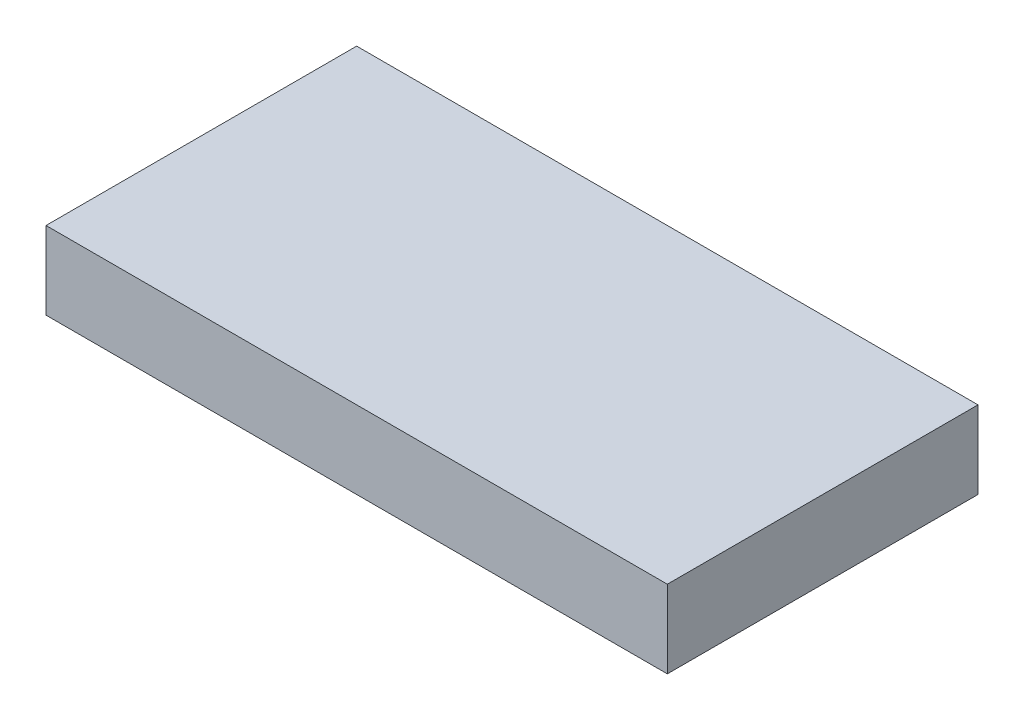
ISO-10303-21;
HEADER;
FILE_DESCRIPTION(('STEP AP214'),'2;1');
FILE_NAME('part.step','',(''),(''),'','','');
FILE_SCHEMA(('AUTOMOTIVE_DESIGN { 1 0 10303 214 1 1 1 1 }'));
ENDSEC;
DATA;
#1=APPLICATION_CONTEXT('core data for automotive mechanical design processes');
#2=APPLICATION_PROTOCOL_DEFINITION('international standard','automotive_design',2000,#1);
#3=PRODUCT_CONTEXT('',#1,'mechanical');
#4=PRODUCT('Part','Part','',(#3));
#5=PRODUCT_RELATED_PRODUCT_CATEGORY('part','',(#4));
#6=PRODUCT_DEFINITION_FORMATION('','',#4);
#7=PRODUCT_DEFINITION_CONTEXT('part definition',#1,'design');
#8=PRODUCT_DEFINITION('design','',#6,#7);
#9=PRODUCT_DEFINITION_SHAPE('','',#8);
#10=(LENGTH_UNIT() NAMED_UNIT(*) SI_UNIT(.MILLI.,.METRE.));
#11=(NAMED_UNIT(*) PLANE_ANGLE_UNIT() SI_UNIT($,.RADIAN.));
#12=(NAMED_UNIT(*) SI_UNIT($,.STERADIAN.) SOLID_ANGLE_UNIT());
#13=UNCERTAINTY_MEASURE_WITH_UNIT(LENGTH_MEASURE(1.E-05),#10,'distance_accuracy_value','');
#14=(GEOMETRIC_REPRESENTATION_CONTEXT(3) GLOBAL_UNCERTAINTY_ASSIGNED_CONTEXT((#13)) GLOBAL_UNIT_ASSIGNED_CONTEXT((#10,
#11,#12)) REPRESENTATION_CONTEXT('',''));
#15=CARTESIAN_POINT('',(0.,0.,0.));
#16=DIRECTION('',(0.,0.,1.));
#17=DIRECTION('',(1.,0.,0.));
#18=AXIS2_PLACEMENT_3D('',#15,#16,#17);
#19=CARTESIAN_POINT('',(25.4,6.35,-12.7));
#20=DIRECTION('',(-1.,0.,0.));
#21=DIRECTION('',(0.,0.,1.));
#22=AXIS2_PLACEMENT_3D('',#19,#20,#21);
#23=PLANE('',#22);
#24=DIRECTION('',(0.,0.,-1.));
#25=VECTOR('',#24,1.);
#26=CARTESIAN_POINT('',(25.4,0.,-12.7));
#27=LINE('',#26,#25);
#28=CARTESIAN_POINT('',(25.4,0.,12.7));
#29=VERTEX_POINT('',#28);
#30=CARTESIAN_POINT('',(25.4,0.,-12.7));
#31=VERTEX_POINT('',#30);
#32=EDGE_CURVE('E100',#29,#31,#27,.T.);
#33=ORIENTED_EDGE('',*,*,#32,.T.);
#34=DIRECTION('',(0.,-1.,0.));
#35=VECTOR('',#34,1.);
#36=CARTESIAN_POINT('',(25.4,6.35,-12.7));
#37=LINE('',#36,#35);
#38=CARTESIAN_POINT('',(25.4,6.35,-12.7));
#39=VERTEX_POINT('',#38);
#40=EDGE_CURVE('E11',#39,#31,#37,.T.);
#41=ORIENTED_EDGE('',*,*,#40,.F.);
#42=DIRECTION('',(0.,0.,-1.));
#43=VECTOR('',#42,1.);
#44=CARTESIAN_POINT('',(25.4,6.35,-12.7));
#45=LINE('',#44,#43);
#46=CARTESIAN_POINT('',(25.4,6.35,12.7));
#47=VERTEX_POINT('',#46);
#48=EDGE_CURVE('E88',#47,#39,#45,.T.);
#49=ORIENTED_EDGE('',*,*,#48,.F.);
#50=DIRECTION('',(0.,-1.,0.));
#51=VECTOR('',#50,1.);
#52=CARTESIAN_POINT('',(25.4,6.35,12.7));
#53=LINE('',#52,#51);
#54=EDGE_CURVE('E96',#47,#29,#53,.T.);
#55=ORIENTED_EDGE('',*,*,#54,.T.);
#56=EDGE_LOOP('',(#33,#41,#49,#55));
#57=FACE_BOUND('',#56,.T.);
#58=ADVANCED_FACE('F37',(#57),#23,.F.);
#59=CARTESIAN_POINT('',(-25.4,6.35,-12.7));
#60=DIRECTION('',(0.,0.,1.));
#61=DIRECTION('',(1.,0.,0.));
#62=AXIS2_PLACEMENT_3D('',#59,#60,#61);
#63=PLANE('',#62);
#64=DIRECTION('',(-1.,0.,0.));
#65=VECTOR('',#64,1.);
#66=CARTESIAN_POINT('',(-25.4,0.,-12.7));
#67=LINE('',#66,#65);
#68=CARTESIAN_POINT('',(-25.4,0.,-12.7));
#69=VERTEX_POINT('',#68);
#70=EDGE_CURVE('E92',#31,#69,#67,.T.);
#71=ORIENTED_EDGE('',*,*,#70,.T.);
#72=DIRECTION('',(0.,-1.,0.));
#73=VECTOR('',#72,1.);
#74=CARTESIAN_POINT('',(-25.4,6.35,-12.7));
#75=LINE('',#74,#73);
#76=CARTESIAN_POINT('',(-25.4,6.35,-12.7));
#77=VERTEX_POINT('',#76);
#78=EDGE_CURVE('E45',#77,#69,#75,.T.);
#79=ORIENTED_EDGE('',*,*,#78,.F.);
#80=DIRECTION('',(-1.,0.,0.));
#81=VECTOR('',#80,1.);
#82=CARTESIAN_POINT('',(-25.4,6.35,-12.7));
#83=LINE('',#82,#81);
#84=EDGE_CURVE('E83',#39,#77,#83,.T.);
#85=ORIENTED_EDGE('',*,*,#84,.F.);
#86=ORIENTED_EDGE('',*,*,#40,.T.);
#87=EDGE_LOOP('',(#71,#79,#85,#86));
#88=FACE_BOUND('',#87,.T.);
#89=ADVANCED_FACE('F91',(#88),#63,.F.);
#90=CARTESIAN_POINT('',(-25.4,6.35,-12.7));
#91=DIRECTION('',(1.,0.,0.));
#92=DIRECTION('',(0.,0.,-1.));
#93=AXIS2_PLACEMENT_3D('',#90,#91,#92);
#94=PLANE('',#93);
#95=DIRECTION('',(0.,0.,1.));
#96=VECTOR('',#95,1.);
#97=CARTESIAN_POINT('',(-25.4,0.,-12.7));
#98=LINE('',#97,#96);
#99=CARTESIAN_POINT('',(-25.4,0.,12.7));
#100=VERTEX_POINT('',#99);
#101=EDGE_CURVE('E70',#69,#100,#98,.T.);
#102=ORIENTED_EDGE('',*,*,#101,.T.);
#103=DIRECTION('',(0.,-1.,0.));
#104=VECTOR('',#103,1.);
#105=CARTESIAN_POINT('',(-25.4,6.35,12.7));
#106=LINE('',#105,#104);
#107=CARTESIAN_POINT('',(-25.4,6.35,12.7));
#108=VERTEX_POINT('',#107);
#109=EDGE_CURVE('E93',#108,#100,#106,.T.);
#110=ORIENTED_EDGE('',*,*,#109,.F.);
#111=DIRECTION('',(0.,0.,1.));
#112=VECTOR('',#111,1.);
#113=CARTESIAN_POINT('',(-25.4,6.35,-12.7));
#114=LINE('',#113,#112);
#115=EDGE_CURVE('E86',#77,#108,#114,.T.);
#116=ORIENTED_EDGE('',*,*,#115,.F.);
#117=ORIENTED_EDGE('',*,*,#78,.T.);
#118=EDGE_LOOP('',(#102,#110,#116,#117));
#119=FACE_BOUND('',#118,.T.);
#120=ADVANCED_FACE('F94',(#119),#94,.F.);
#121=CARTESIAN_POINT('',(-25.4,6.35,12.7));
#122=DIRECTION('',(0.,0.,-1.));
#123=DIRECTION('',(-1.,0.,0.));
#124=AXIS2_PLACEMENT_3D('',#121,#122,#123);
#125=PLANE('',#124);
#126=DIRECTION('',(1.,0.,0.));
#127=VECTOR('',#126,1.);
#128=CARTESIAN_POINT('',(-25.4,0.,12.7));
#129=LINE('',#128,#127);
#130=EDGE_CURVE('E76',#100,#29,#129,.T.);
#131=ORIENTED_EDGE('',*,*,#130,.T.);
#132=ORIENTED_EDGE('',*,*,#54,.F.);
#133=DIRECTION('',(1.,0.,0.));
#134=VECTOR('',#133,1.);
#135=CARTESIAN_POINT('',(-25.4,6.35,12.7));
#136=LINE('',#135,#134);
#137=EDGE_CURVE('E53',#108,#47,#136,.T.);
#138=ORIENTED_EDGE('',*,*,#137,.F.);
#139=ORIENTED_EDGE('',*,*,#109,.T.);
#140=EDGE_LOOP('',(#131,#132,#138,#139));
#141=FACE_BOUND('',#140,.T.);
#142=ADVANCED_FACE('F107',(#141),#125,.F.);
#143=CARTESIAN_POINT('',(0.,6.35,0.));
#144=DIRECTION('',(0.,1.,0.));
#145=DIRECTION('',(0.,0.,1.));
#146=AXIS2_PLACEMENT_3D('',#143,#144,#145);
#147=PLANE('',#146);
#148=ORIENTED_EDGE('',*,*,#48,.T.);
#149=ORIENTED_EDGE('',*,*,#84,.T.);
#150=ORIENTED_EDGE('',*,*,#115,.T.);
#151=ORIENTED_EDGE('',*,*,#137,.T.);
#152=EDGE_LOOP('',(#148,#149,#150,#151));
#153=FACE_BOUND('',#152,.T.);
#154=ADVANCED_FACE('F84',(#153),#147,.T.);
#155=CARTESIAN_POINT('',(0.,0.,0.));
#156=DIRECTION('',(0.,1.,0.));
#157=DIRECTION('',(0.,0.,1.));
#158=AXIS2_PLACEMENT_3D('',#155,#156,#157);
#159=PLANE('',#158);
#160=ORIENTED_EDGE('',*,*,#32,.F.);
#161=ORIENTED_EDGE('',*,*,#130,.F.);
#162=ORIENTED_EDGE('',*,*,#101,.F.);
#163=ORIENTED_EDGE('',*,*,#70,.F.);
#164=EDGE_LOOP('',(#160,#161,#162,#163));
#165=FACE_BOUND('',#164,.T.);
#166=ADVANCED_FACE('F110',(#165),#159,.F.);
#167=CLOSED_SHELL('',(#58,#89,#120,#142,#154,#166));
#168=MANIFOLD_SOLID_BREP('B2',#167);
#169=ADVANCED_BREP_SHAPE_REPRESENTATION('',(#18,#168),#14);
#170=SHAPE_DEFINITION_REPRESENTATION(#9,#169);
ENDSEC;
END-ISO-10303-21;
